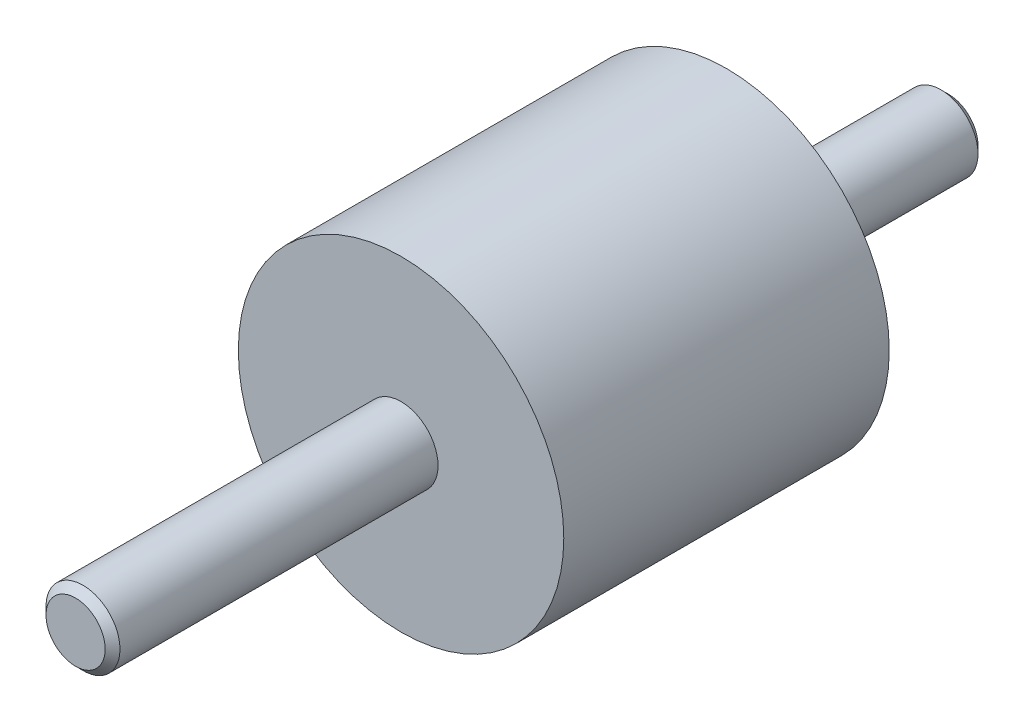
ISO-10303-21;
HEADER;
FILE_DESCRIPTION(('STEP AP214'),'2;1');
FILE_NAME('part.step','',(''),(''),'','','');
FILE_SCHEMA(('AUTOMOTIVE_DESIGN { 1 0 10303 214 1 1 1 1 }'));
ENDSEC;
DATA;
#1=APPLICATION_CONTEXT('core data for automotive mechanical design processes');
#2=APPLICATION_PROTOCOL_DEFINITION('international standard','automotive_design',2000,#1);
#3=PRODUCT_CONTEXT('',#1,'mechanical');
#4=PRODUCT('Part','Part','',(#3));
#5=PRODUCT_RELATED_PRODUCT_CATEGORY('part','',(#4));
#6=PRODUCT_DEFINITION_FORMATION('','',#4);
#7=PRODUCT_DEFINITION_CONTEXT('part definition',#1,'design');
#8=PRODUCT_DEFINITION('design','',#6,#7);
#9=PRODUCT_DEFINITION_SHAPE('','',#8);
#10=(LENGTH_UNIT() NAMED_UNIT(*) SI_UNIT(.MILLI.,.METRE.));
#11=(NAMED_UNIT(*) PLANE_ANGLE_UNIT() SI_UNIT($,.RADIAN.));
#12=(NAMED_UNIT(*) SI_UNIT($,.STERADIAN.) SOLID_ANGLE_UNIT());
#13=UNCERTAINTY_MEASURE_WITH_UNIT(LENGTH_MEASURE(1.E-05),#10,'distance_accuracy_value','');
#14=(GEOMETRIC_REPRESENTATION_CONTEXT(3) GLOBAL_UNCERTAINTY_ASSIGNED_CONTEXT((#13)) GLOBAL_UNIT_ASSIGNED_CONTEXT((#10,
#11,#12)) REPRESENTATION_CONTEXT('',''));
#15=CARTESIAN_POINT('',(0.,0.,0.));
#16=DIRECTION('',(0.,0.,1.));
#17=DIRECTION('',(1.,0.,0.));
#18=AXIS2_PLACEMENT_3D('',#15,#16,#17);
#19=CARTESIAN_POINT('',(0.,0.,22.));
#20=DIRECTION('',(0.,0.,-1.));
#21=DIRECTION('',(-1.,0.,0.));
#22=AXIS2_PLACEMENT_3D('',#19,#20,#21);
#23=CYLINDRICAL_SURFACE('',#22,11.);
#24=CARTESIAN_POINT('',(0.,0.,22.));
#25=DIRECTION('',(0.,0.,1.));
#26=DIRECTION('',(1.,0.,0.));
#27=AXIS2_PLACEMENT_3D('',#24,#25,#26);
#28=CIRCLE('',#27,11.);
#29=CARTESIAN_POINT('',(11.,0.,22.));
#30=VERTEX_POINT('',#29);
#31=EDGE_CURVE('E77',#30,#30,#28,.T.);
#32=ORIENTED_EDGE('',*,*,#31,.F.);
#33=EDGE_LOOP('',(#32));
#34=FACE_BOUND('',#33,.T.);
#35=CARTESIAN_POINT('',(0.,0.,0.));
#36=DIRECTION('',(0.,0.,1.));
#37=DIRECTION('',(1.,0.,0.));
#38=AXIS2_PLACEMENT_3D('',#35,#36,#37);
#39=CIRCLE('',#38,11.);
#40=CARTESIAN_POINT('',(11.,0.,0.));
#41=VERTEX_POINT('',#40);
#42=EDGE_CURVE('E74',#41,#41,#39,.T.);
#43=ORIENTED_EDGE('',*,*,#42,.T.);
#44=EDGE_LOOP('',(#43));
#45=FACE_BOUND('',#44,.T.);
#46=ADVANCED_FACE('F49',(#34,#45),#23,.T.);
#47=CARTESIAN_POINT('',(0.,0.,22.));
#48=DIRECTION('',(0.,0.,1.));
#49=DIRECTION('',(1.,0.,0.));
#50=AXIS2_PLACEMENT_3D('',#47,#48,#49);
#51=PLANE('',#50);
#52=CARTESIAN_POINT('',(0.,0.,22.));
#53=DIRECTION('',(0.,0.,1.));
#54=DIRECTION('',(1.,0.,0.));
#55=AXIS2_PLACEMENT_3D('',#52,#53,#54);
#56=CIRCLE('',#55,2.5);
#57=CARTESIAN_POINT('',(2.5,0.,22.));
#58=VERTEX_POINT('',#57);
#59=EDGE_CURVE('E70',#58,#58,#56,.T.);
#60=ORIENTED_EDGE('',*,*,#59,.F.);
#61=EDGE_LOOP('',(#60));
#62=FACE_BOUND('',#61,.T.);
#63=ORIENTED_EDGE('',*,*,#31,.T.);
#64=EDGE_LOOP('',(#63));
#65=FACE_BOUND('',#64,.T.);
#66=ADVANCED_FACE('F85',(#62,#65),#51,.T.);
#67=CARTESIAN_POINT('',(0.,0.,0.));
#68=DIRECTION('',(0.,0.,1.));
#69=DIRECTION('',(1.,0.,0.));
#70=AXIS2_PLACEMENT_3D('',#67,#68,#69);
#71=PLANE('',#70);
#72=CARTESIAN_POINT('',(0.,0.,0.));
#73=DIRECTION('',(0.,0.,1.));
#74=DIRECTION('',(1.,0.,0.));
#75=AXIS2_PLACEMENT_3D('',#72,#73,#74);
#76=CIRCLE('',#75,2.5);
#77=CARTESIAN_POINT('',(2.5,0.,0.));
#78=VERTEX_POINT('',#77);
#79=EDGE_CURVE('E71',#78,#78,#76,.T.);
#80=ORIENTED_EDGE('',*,*,#79,.T.);
#81=EDGE_LOOP('',(#80));
#82=FACE_BOUND('',#81,.T.);
#83=ORIENTED_EDGE('',*,*,#42,.F.);
#84=EDGE_LOOP('',(#83));
#85=FACE_BOUND('',#84,.T.);
#86=ADVANCED_FACE('F88',(#82,#85),#71,.F.);
#87=CARTESIAN_POINT('',(0.,0.,-15.));
#88=DIRECTION('',(0.,0.,1.));
#89=DIRECTION('',(1.,0.,0.));
#90=AXIS2_PLACEMENT_3D('',#87,#88,#89);
#91=PLANE('',#90);
#92=CARTESIAN_POINT('',(0.,0.,-15.));
#93=DIRECTION('',(0.,0.,1.));
#94=DIRECTION('',(1.,0.,0.));
#95=AXIS2_PLACEMENT_3D('',#92,#93,#94);
#96=CIRCLE('',#95,2.);
#97=CARTESIAN_POINT('',(2.,0.,-15.));
#98=VERTEX_POINT('',#97);
#99=EDGE_CURVE('E65',#98,#98,#96,.F.);
#100=ORIENTED_EDGE('',*,*,#99,.T.);
#101=EDGE_LOOP('',(#100));
#102=FACE_BOUND('',#101,.T.);
#103=ADVANCED_FACE('F98',(#102),#91,.F.);
#104=CARTESIAN_POINT('',(0.,0.,-37.0710678118655));
#105=DIRECTION('',(0.,0.,1.));
#106=DIRECTION('',(1.,0.,0.));
#107=AXIS2_PLACEMENT_3D('',#104,#105,#106);
#108=CYLINDRICAL_SURFACE('',#107,2.5);
#109=CARTESIAN_POINT('',(0.,0.,-14.5));
#110=DIRECTION('',(0.,0.,1.));
#111=DIRECTION('',(1.,0.,0.));
#112=AXIS2_PLACEMENT_3D('',#109,#110,#111);
#113=CIRCLE('',#112,2.5);
#114=CARTESIAN_POINT('',(2.5,0.,-14.5));
#115=VERTEX_POINT('',#114);
#116=EDGE_CURVE('E61',#115,#115,#113,.T.);
#117=ORIENTED_EDGE('',*,*,#116,.T.);
#118=EDGE_LOOP('',(#117));
#119=FACE_BOUND('',#118,.T.);
#120=ORIENTED_EDGE('',*,*,#79,.F.);
#121=EDGE_LOOP('',(#120));
#122=FACE_BOUND('',#121,.T.);
#123=ADVANCED_FACE('F104',(#119,#122),#108,.T.);
#124=CARTESIAN_POINT('',(0.,0.,43.5));
#125=DIRECTION('',(0.,0.,1.));
#126=DIRECTION('',(1.,0.,0.));
#127=AXIS2_PLACEMENT_3D('',#124,#125,#126);
#128=CIRCLE('',#127,2.5);
#129=CARTESIAN_POINT('',(2.5,0.,43.5));
#130=VERTEX_POINT('',#129);
#131=EDGE_CURVE('E11',#130,#130,#128,.F.);
#132=ORIENTED_EDGE('',*,*,#131,.T.);
#133=EDGE_LOOP('',(#132));
#134=FACE_BOUND('',#133,.T.);
#135=ORIENTED_EDGE('',*,*,#59,.T.);
#136=EDGE_LOOP('',(#135));
#137=FACE_BOUND('',#136,.T.);
#138=ADVANCED_FACE('F83',(#134,#137),#108,.T.);
#139=CARTESIAN_POINT('',(0.,0.,44.));
#140=DIRECTION('',(0.,0.,1.));
#141=DIRECTION('',(1.,0.,0.));
#142=AXIS2_PLACEMENT_3D('',#139,#140,#141);
#143=PLANE('',#142);
#144=CARTESIAN_POINT('',(0.,0.,44.));
#145=DIRECTION('',(0.,0.,1.));
#146=DIRECTION('',(1.,0.,0.));
#147=AXIS2_PLACEMENT_3D('',#144,#145,#146);
#148=CIRCLE('',#147,2.);
#149=CARTESIAN_POINT('',(2.,0.,44.));
#150=VERTEX_POINT('',#149);
#151=EDGE_CURVE('E57',#150,#150,#148,.T.);
#152=ORIENTED_EDGE('',*,*,#151,.T.);
#153=EDGE_LOOP('',(#152));
#154=FACE_BOUND('',#153,.T.);
#155=ADVANCED_FACE('F113',(#154),#143,.T.);
#156=CARTESIAN_POINT('',(0.,0.,-15.));
#157=DIRECTION('',(0.,0.,1.));
#158=DIRECTION('',(1.,0.,0.));
#159=AXIS2_PLACEMENT_3D('',#156,#157,#158);
#160=CONICAL_SURFACE('',#159,2.,0.785398163397446);
#161=ORIENTED_EDGE('',*,*,#116,.F.);
#162=EDGE_LOOP('',(#161));
#163=FACE_BOUND('',#162,.T.);
#164=ORIENTED_EDGE('',*,*,#99,.F.);
#165=EDGE_LOOP('',(#164));
#166=FACE_BOUND('',#165,.T.);
#167=ADVANCED_FACE('F109',(#163,#166),#160,.T.);
#168=CARTESIAN_POINT('',(0.,0.,44.));
#169=DIRECTION('',(0.,0.,-1.));
#170=DIRECTION('',(-1.,0.,0.));
#171=AXIS2_PLACEMENT_3D('',#168,#169,#170);
#172=CONICAL_SURFACE('',#171,2.,0.785398163397446);
#173=ORIENTED_EDGE('',*,*,#131,.F.);
#174=EDGE_LOOP('',(#173));
#175=FACE_BOUND('',#174,.T.);
#176=ORIENTED_EDGE('',*,*,#151,.F.);
#177=EDGE_LOOP('',(#176));
#178=FACE_BOUND('',#177,.T.);
#179=ADVANCED_FACE('F52',(#175,#178),#172,.T.);
#180=CLOSED_SHELL('',(#46,#66,#86,#103,#123,#138,#155,#167,#179));
#181=MANIFOLD_SOLID_BREP('B2',#180);
#182=ADVANCED_BREP_SHAPE_REPRESENTATION('',(#18,#181),#14);
#183=SHAPE_DEFINITION_REPRESENTATION(#9,#182);
ENDSEC;
END-ISO-10303-21;
